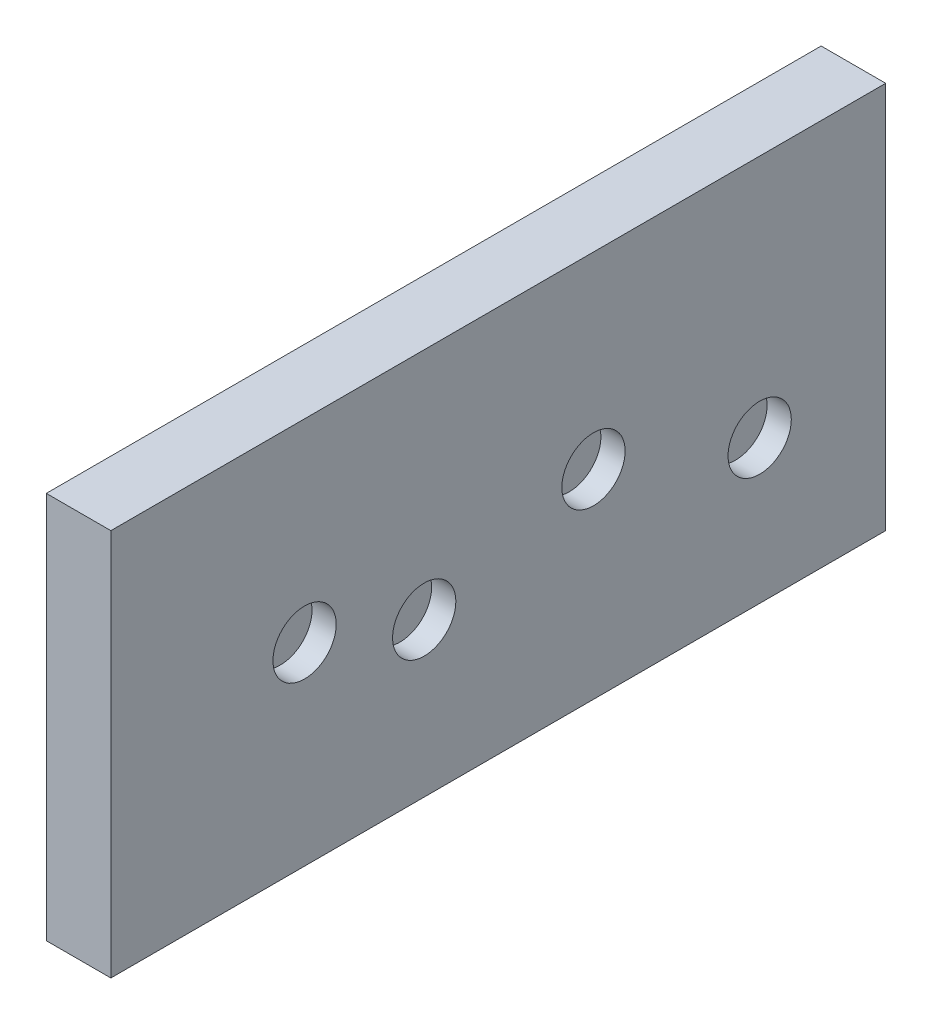
ISO-10303-21;
HEADER;
FILE_DESCRIPTION(('STEP AP214'),'2;1');
FILE_NAME('part.step','',(''),(''),'','','');
FILE_SCHEMA(('AUTOMOTIVE_DESIGN { 1 0 10303 214 1 1 1 1 }'));
ENDSEC;
DATA;
#1=APPLICATION_CONTEXT('core data for automotive mechanical design processes');
#2=APPLICATION_PROTOCOL_DEFINITION('international standard','automotive_design',2000,#1);
#3=PRODUCT_CONTEXT('',#1,'mechanical');
#4=PRODUCT('Part','Part','',(#3));
#5=PRODUCT_RELATED_PRODUCT_CATEGORY('part','',(#4));
#6=PRODUCT_DEFINITION_FORMATION('','',#4);
#7=PRODUCT_DEFINITION_CONTEXT('part definition',#1,'design');
#8=PRODUCT_DEFINITION('design','',#6,#7);
#9=PRODUCT_DEFINITION_SHAPE('','',#8);
#10=(LENGTH_UNIT() NAMED_UNIT(*) SI_UNIT(.MILLI.,.METRE.));
#11=(NAMED_UNIT(*) PLANE_ANGLE_UNIT() SI_UNIT($,.RADIAN.));
#12=(NAMED_UNIT(*) SI_UNIT($,.STERADIAN.) SOLID_ANGLE_UNIT());
#13=UNCERTAINTY_MEASURE_WITH_UNIT(LENGTH_MEASURE(1.E-05),#10,'distance_accuracy_value','');
#14=(GEOMETRIC_REPRESENTATION_CONTEXT(3) GLOBAL_UNCERTAINTY_ASSIGNED_CONTEXT((#13)) GLOBAL_UNIT_ASSIGNED_CONTEXT((#10,
#11,#12)) REPRESENTATION_CONTEXT('',''));
#15=CARTESIAN_POINT('',(0.,0.,0.));
#16=DIRECTION('',(0.,0.,1.));
#17=DIRECTION('',(1.,0.,0.));
#18=AXIS2_PLACEMENT_3D('',#15,#16,#17);
#19=CARTESIAN_POINT('',(12.7,-38.1,0.));
#20=DIRECTION('',(0.,1.,0.));
#21=DIRECTION('',(0.,0.,1.));
#22=AXIS2_PLACEMENT_3D('',#19,#20,#21);
#23=PLANE('',#22);
#24=DIRECTION('',(0.,0.,-1.));
#25=VECTOR('',#24,1.);
#26=CARTESIAN_POINT('',(0.,-38.1,0.));
#27=LINE('',#26,#25);
#28=CARTESIAN_POINT('',(0.,-38.1,76.2));
#29=VERTEX_POINT('',#28);
#30=CARTESIAN_POINT('',(0.,-38.1,-76.2));
#31=VERTEX_POINT('',#30);
#32=EDGE_CURVE('E104',#29,#31,#27,.T.);
#33=ORIENTED_EDGE('',*,*,#32,.T.);
#34=DIRECTION('',(-1.,0.,0.));
#35=VECTOR('',#34,1.);
#36=CARTESIAN_POINT('',(12.7,-38.1,-76.2));
#37=LINE('',#36,#35);
#38=CARTESIAN_POINT('',(12.7,-38.1,-76.2));
#39=VERTEX_POINT('',#38);
#40=EDGE_CURVE('E11',#39,#31,#37,.T.);
#41=ORIENTED_EDGE('',*,*,#40,.F.);
#42=DIRECTION('',(0.,0.,-1.));
#43=VECTOR('',#42,1.);
#44=CARTESIAN_POINT('',(12.7,-38.1,0.));
#45=LINE('',#44,#43);
#46=CARTESIAN_POINT('',(12.7,-38.1,76.2));
#47=VERTEX_POINT('',#46);
#48=EDGE_CURVE('E90',#47,#39,#45,.T.);
#49=ORIENTED_EDGE('',*,*,#48,.F.);
#50=DIRECTION('',(-1.,0.,0.));
#51=VECTOR('',#50,1.);
#52=CARTESIAN_POINT('',(12.7,-38.1,76.2));
#53=LINE('',#52,#51);
#54=EDGE_CURVE('E57',#47,#29,#53,.T.);
#55=ORIENTED_EDGE('',*,*,#54,.T.);
#56=EDGE_LOOP('',(#33,#41,#49,#55));
#57=FACE_BOUND('',#56,.T.);
#58=ADVANCED_FACE('F41',(#57),#23,.F.);
#59=CARTESIAN_POINT('',(12.7,0.,-76.2));
#60=DIRECTION('',(0.,0.,1.));
#61=DIRECTION('',(1.,0.,0.));
#62=AXIS2_PLACEMENT_3D('',#59,#60,#61);
#63=PLANE('',#62);
#64=DIRECTION('',(0.,1.,0.));
#65=VECTOR('',#64,1.);
#66=CARTESIAN_POINT('',(0.,0.,-76.2));
#67=LINE('',#66,#65);
#68=CARTESIAN_POINT('',(0.,38.1,-76.2));
#69=VERTEX_POINT('',#68);
#70=EDGE_CURVE('E95',#31,#69,#67,.T.);
#71=ORIENTED_EDGE('',*,*,#70,.T.);
#72=DIRECTION('',(-1.,0.,0.));
#73=VECTOR('',#72,1.);
#74=CARTESIAN_POINT('',(12.7,38.1,-76.2));
#75=LINE('',#74,#73);
#76=CARTESIAN_POINT('',(12.7,38.1,-76.2));
#77=VERTEX_POINT('',#76);
#78=EDGE_CURVE('E49',#77,#69,#75,.T.);
#79=ORIENTED_EDGE('',*,*,#78,.F.);
#80=DIRECTION('',(0.,1.,0.));
#81=VECTOR('',#80,1.);
#82=CARTESIAN_POINT('',(12.7,0.,-76.2));
#83=LINE('',#82,#81);
#84=EDGE_CURVE('E82',#39,#77,#83,.T.);
#85=ORIENTED_EDGE('',*,*,#84,.F.);
#86=ORIENTED_EDGE('',*,*,#40,.T.);
#87=EDGE_LOOP('',(#71,#79,#85,#86));
#88=FACE_BOUND('',#87,.T.);
#89=ADVANCED_FACE('F94',(#88),#63,.F.);
#90=CARTESIAN_POINT('',(12.7,38.1,0.));
#91=DIRECTION('',(0.,1.,0.));
#92=DIRECTION('',(0.,0.,1.));
#93=AXIS2_PLACEMENT_3D('',#90,#91,#92);
#94=PLANE('',#93);
#95=DIRECTION('',(0.,0.,-1.));
#96=VECTOR('',#95,1.);
#97=CARTESIAN_POINT('',(0.,38.1,0.));
#98=LINE('',#97,#96);
#99=CARTESIAN_POINT('',(0.,38.1,76.2));
#100=VERTEX_POINT('',#99);
#101=EDGE_CURVE('E108',#100,#69,#98,.T.);
#102=ORIENTED_EDGE('',*,*,#101,.F.);
#103=DIRECTION('',(-1.,0.,0.));
#104=VECTOR('',#103,1.);
#105=CARTESIAN_POINT('',(12.7,38.1,76.2));
#106=LINE('',#105,#104);
#107=CARTESIAN_POINT('',(12.7,38.1,76.2));
#108=VERTEX_POINT('',#107);
#109=EDGE_CURVE('E71',#108,#100,#106,.T.);
#110=ORIENTED_EDGE('',*,*,#109,.F.);
#111=DIRECTION('',(0.,0.,-1.));
#112=VECTOR('',#111,1.);
#113=CARTESIAN_POINT('',(12.7,38.1,0.));
#114=LINE('',#113,#112);
#115=EDGE_CURVE('E89',#108,#77,#114,.T.);
#116=ORIENTED_EDGE('',*,*,#115,.T.);
#117=ORIENTED_EDGE('',*,*,#78,.T.);
#118=EDGE_LOOP('',(#102,#110,#116,#117));
#119=FACE_BOUND('',#118,.T.);
#120=ADVANCED_FACE('F98',(#119),#94,.T.);
#121=CARTESIAN_POINT('',(12.7,0.,76.2));
#122=DIRECTION('',(0.,0.,1.));
#123=DIRECTION('',(1.,0.,0.));
#124=AXIS2_PLACEMENT_3D('',#121,#122,#123);
#125=PLANE('',#124);
#126=DIRECTION('',(0.,1.,0.));
#127=VECTOR('',#126,1.);
#128=CARTESIAN_POINT('',(0.,0.,76.2));
#129=LINE('',#128,#127);
#130=EDGE_CURVE('E110',#29,#100,#129,.T.);
#131=ORIENTED_EDGE('',*,*,#130,.F.);
#132=ORIENTED_EDGE('',*,*,#54,.F.);
#133=DIRECTION('',(0.,1.,0.));
#134=VECTOR('',#133,1.);
#135=CARTESIAN_POINT('',(12.7,0.,76.2));
#136=LINE('',#135,#134);
#137=EDGE_CURVE('E99',#47,#108,#136,.T.);
#138=ORIENTED_EDGE('',*,*,#137,.T.);
#139=ORIENTED_EDGE('',*,*,#109,.T.);
#140=EDGE_LOOP('',(#131,#132,#138,#139));
#141=FACE_BOUND('',#140,.T.);
#142=ADVANCED_FACE('F156',(#141),#125,.T.);
#143=CARTESIAN_POINT('',(12.7,0.,0.));
#144=DIRECTION('',(1.,0.,0.));
#145=DIRECTION('',(0.,0.,-1.));
#146=AXIS2_PLACEMENT_3D('',#143,#144,#145);
#147=PLANE('',#146);
#148=CARTESIAN_POINT('',(12.7,0.,38.1));
#149=DIRECTION('',(-1.,0.,0.));
#150=DIRECTION('',(0.,0.,1.));
#151=AXIS2_PLACEMENT_3D('',#148,#149,#150);
#152=CIRCLE('',#151,6.223);
#153=CARTESIAN_POINT('',(12.7,0.,31.877));
#154=VERTEX_POINT('',#153);
#155=EDGE_CURVE('E134',#154,#154,#152,.T.);
#156=ORIENTED_EDGE('',*,*,#155,.T.);
#157=EDGE_LOOP('',(#156));
#158=FACE_BOUND('',#157,.T.);
#159=CARTESIAN_POINT('',(12.7,-7.860160654,14.5712240149026));
#160=DIRECTION('',(-1.,0.,0.));
#161=DIRECTION('',(0.,0.,1.));
#162=AXIS2_PLACEMENT_3D('',#159,#160,#161);
#163=CIRCLE('',#162,6.223);
#164=CARTESIAN_POINT('',(12.7,-7.860160654,8.34822401490261));
#165=VERTEX_POINT('',#164);
#166=EDGE_CURVE('E131',#165,#165,#163,.T.);
#167=ORIENTED_EDGE('',*,*,#166,.T.);
#168=EDGE_LOOP('',(#167));
#169=FACE_BOUND('',#168,.T.);
#170=CARTESIAN_POINT('',(12.7,1.096077429,-18.7225315801618));
#171=DIRECTION('',(-1.,0.,0.));
#172=DIRECTION('',(0.,0.,1.));
#173=AXIS2_PLACEMENT_3D('',#170,#171,#172);
#174=CIRCLE('',#173,6.223);
#175=CARTESIAN_POINT('',(12.7,1.096077429,-24.9455315801618));
#176=VERTEX_POINT('',#175);
#177=EDGE_CURVE('E125',#176,#176,#174,.T.);
#178=ORIENTED_EDGE('',*,*,#177,.T.);
#179=EDGE_LOOP('',(#178));
#180=FACE_BOUND('',#179,.T.);
#181=CARTESIAN_POINT('',(12.7,-9.873506971,-51.4082559918149));
#182=DIRECTION('',(-1.,0.,0.));
#183=DIRECTION('',(0.,0.,1.));
#184=AXIS2_PLACEMENT_3D('',#181,#182,#183);
#185=CIRCLE('',#184,6.223);
#186=CARTESIAN_POINT('',(12.7,-9.873506971,-57.6312559918149));
#187=VERTEX_POINT('',#186);
#188=EDGE_CURVE('E119',#187,#187,#185,.T.);
#189=ORIENTED_EDGE('',*,*,#188,.T.);
#190=EDGE_LOOP('',(#189));
#191=FACE_BOUND('',#190,.T.);
#192=ORIENTED_EDGE('',*,*,#48,.T.);
#193=ORIENTED_EDGE('',*,*,#84,.T.);
#194=ORIENTED_EDGE('',*,*,#115,.F.);
#195=ORIENTED_EDGE('',*,*,#137,.F.);
#196=EDGE_LOOP('',(#192,#193,#194,#195));
#197=FACE_BOUND('',#196,.T.);
#198=ADVANCED_FACE('F86',(#158,#169,#180,#191,#197),#147,.T.);
#199=CARTESIAN_POINT('',(0.,0.,0.));
#200=DIRECTION('',(1.,0.,0.));
#201=DIRECTION('',(0.,0.,-1.));
#202=AXIS2_PLACEMENT_3D('',#199,#200,#201);
#203=PLANE('',#202);
#204=ORIENTED_EDGE('',*,*,#32,.F.);
#205=ORIENTED_EDGE('',*,*,#130,.T.);
#206=ORIENTED_EDGE('',*,*,#101,.T.);
#207=ORIENTED_EDGE('',*,*,#70,.F.);
#208=EDGE_LOOP('',(#204,#205,#206,#207));
#209=FACE_BOUND('',#208,.T.);
#210=ADVANCED_FACE('F155',(#209),#203,.F.);
#211=CARTESIAN_POINT('',(7.9375,-9.873506971,-51.4082559918149));
#212=DIRECTION('',(1.,0.,0.));
#213=DIRECTION('',(0.,0.,-1.));
#214=AXIS2_PLACEMENT_3D('',#211,#212,#213);
#215=CYLINDRICAL_SURFACE('',#214,6.223);
#216=CARTESIAN_POINT('',(7.9375,-9.873506971,-51.4082559918149));
#217=DIRECTION('',(-1.,0.,0.));
#218=DIRECTION('',(0.,0.,1.));
#219=AXIS2_PLACEMENT_3D('',#216,#217,#218);
#220=CIRCLE('',#219,6.223);
#221=CARTESIAN_POINT('',(7.9375,-9.873506971,-57.6312559918149));
#222=VERTEX_POINT('',#221);
#223=EDGE_CURVE('E116',#222,#222,#220,.T.);
#224=CARTESIAN_POINT('',(7.9375,-9.873506971,-57.6312559918149));
#225=CARTESIAN_POINT('',(7.987109375,-9.873506971,-57.6312559918149));
#226=CARTESIAN_POINT('',(8.03671875,-9.873506971,-57.6312559918149));
#227=CARTESIAN_POINT('',(8.1359375,-9.873506971,-57.6312559918149));
#228=CARTESIAN_POINT('',(8.185546875,-9.873506971,-57.6312559918149));
#229=CARTESIAN_POINT('',(8.284765625,-9.873506971,-57.6312559918149));
#230=CARTESIAN_POINT('',(8.334375,-9.873506971,-57.6312559918149));
#231=CARTESIAN_POINT('',(8.43359375,-9.873506971,-57.6312559918149));
#232=CARTESIAN_POINT('',(8.483203125,-9.873506971,-57.6312559918149));
#233=CARTESIAN_POINT('',(8.582421875,-9.873506971,-57.6312559918149));
#234=CARTESIAN_POINT('',(8.63203125,-9.873506971,-57.6312559918149));
#235=CARTESIAN_POINT('',(8.73125,-9.873506971,-57.6312559918149));
#236=CARTESIAN_POINT('',(8.780859375,-9.873506971,-57.6312559918149));
#237=CARTESIAN_POINT('',(8.880078125,-9.873506971,-57.6312559918149));
#238=CARTESIAN_POINT('',(8.9296875,-9.873506971,-57.6312559918149));
#239=CARTESIAN_POINT('',(9.02890625,-9.873506971,-57.6312559918149));
#240=CARTESIAN_POINT('',(9.078515625,-9.873506971,-57.6312559918149));
#241=CARTESIAN_POINT('',(9.177734375,-9.873506971,-57.6312559918149));
#242=CARTESIAN_POINT('',(9.22734375,-9.873506971,-57.6312559918149));
#243=CARTESIAN_POINT('',(9.3265625,-9.873506971,-57.6312559918149));
#244=CARTESIAN_POINT('',(9.376171875,-9.873506971,-57.6312559918149));
#245=CARTESIAN_POINT('',(9.475390625,-9.873506971,-57.6312559918149));
#246=CARTESIAN_POINT('',(9.525,-9.873506971,-57.6312559918149));
#247=CARTESIAN_POINT('',(9.62421875,-9.873506971,-57.6312559918149));
#248=CARTESIAN_POINT('',(9.673828125,-9.873506971,-57.6312559918149));
#249=CARTESIAN_POINT('',(9.773046875,-9.873506971,-57.6312559918149));
#250=CARTESIAN_POINT('',(9.82265625,-9.873506971,-57.6312559918149));
#251=CARTESIAN_POINT('',(9.921875,-9.873506971,-57.6312559918149));
#252=CARTESIAN_POINT('',(9.971484375,-9.873506971,-57.6312559918149));
#253=CARTESIAN_POINT('',(10.070703125,-9.873506971,-57.6312559918149));
#254=CARTESIAN_POINT('',(10.1203125,-9.873506971,-57.6312559918149));
#255=CARTESIAN_POINT('',(10.21953125,-9.873506971,-57.6312559918149));
#256=CARTESIAN_POINT('',(10.269140625,-9.873506971,-57.6312559918149));
#257=CARTESIAN_POINT('',(10.368359375,-9.873506971,-57.6312559918149));
#258=CARTESIAN_POINT('',(10.41796875,-9.873506971,-57.6312559918149));
#259=CARTESIAN_POINT('',(10.5171875,-9.873506971,-57.6312559918149));
#260=CARTESIAN_POINT('',(10.566796875,-9.873506971,-57.6312559918149));
#261=CARTESIAN_POINT('',(10.666015625,-9.873506971,-57.6312559918149));
#262=CARTESIAN_POINT('',(10.715625,-9.873506971,-57.6312559918149));
#263=CARTESIAN_POINT('',(10.81484375,-9.873506971,-57.6312559918149));
#264=CARTESIAN_POINT('',(10.864453125,-9.873506971,-57.6312559918149));
#265=CARTESIAN_POINT('',(10.963671875,-9.873506971,-57.6312559918149));
#266=CARTESIAN_POINT('',(11.01328125,-9.873506971,-57.6312559918149));
#267=CARTESIAN_POINT('',(11.1125,-9.873506971,-57.6312559918149));
#268=CARTESIAN_POINT('',(11.162109375,-9.873506971,-57.6312559918149));
#269=CARTESIAN_POINT('',(11.261328125,-9.873506971,-57.6312559918149));
#270=CARTESIAN_POINT('',(11.3109375,-9.873506971,-57.6312559918149));
#271=CARTESIAN_POINT('',(11.41015625,-9.873506971,-57.6312559918149));
#272=CARTESIAN_POINT('',(11.459765625,-9.873506971,-57.6312559918149));
#273=CARTESIAN_POINT('',(11.558984375,-9.873506971,-57.6312559918149));
#274=CARTESIAN_POINT('',(11.60859375,-9.873506971,-57.6312559918149));
#275=CARTESIAN_POINT('',(11.7078125,-9.873506971,-57.6312559918149));
#276=CARTESIAN_POINT('',(11.757421875,-9.873506971,-57.6312559918149));
#277=CARTESIAN_POINT('',(11.856640625,-9.873506971,-57.6312559918149));
#278=CARTESIAN_POINT('',(11.90625,-9.873506971,-57.6312559918149));
#279=CARTESIAN_POINT('',(12.00546875,-9.873506971,-57.6312559918149));
#280=CARTESIAN_POINT('',(12.055078125,-9.873506971,-57.6312559918149));
#281=CARTESIAN_POINT('',(12.154296875,-9.873506971,-57.6312559918149));
#282=CARTESIAN_POINT('',(12.20390625,-9.873506971,-57.6312559918149));
#283=CARTESIAN_POINT('',(12.303125,-9.873506971,-57.6312559918149));
#284=CARTESIAN_POINT('',(12.352734375,-9.873506971,-57.6312559918149));
#285=CARTESIAN_POINT('',(12.451953125,-9.873506971,-57.6312559918149));
#286=CARTESIAN_POINT('',(12.5015625,-9.873506971,-57.6312559918149));
#287=CARTESIAN_POINT('',(12.60078125,-9.873506971,-57.6312559918149));
#288=CARTESIAN_POINT('',(12.650390625,-9.873506971,-57.6312559918149));
#289=CARTESIAN_POINT('',(12.7,-9.873506971,-57.6312559918149));
#290=B_SPLINE_CURVE_WITH_KNOTS('',3,(#224,#225,#226,#227,#228,#229,#230,#231,#232,#233,#234,
#235,#236,#237,#238,#239,#240,#241,#242,#243,#244,#245,#246,#247,#248,#249,#250,#251,#252,#253,
#254,#255,#256,#257,#258,#259,#260,#261,#262,#263,#264,#265,#266,#267,#268,#269,#270,#271,#272,
#273,#274,#275,#276,#277,#278,#279,#280,#281,#282,#283,#284,#285,#286,#287,#288,#289),
.UNSPECIFIED.,.F.,.F.,(4,2,2,2,2,2,2,2,2,2,2,2,2,2,2,2,2,2,2,2,2,2,2,2,2,2,2,2,2,2,2,2,4),(0.,
0.148828124999998,0.297656249999998,0.446484374999999,0.595312499999999,0.744140624999999,
0.892968749999999,1.041796875,1.190625,1.339453125,1.48828125,1.637109375,1.7859375,1.934765625,
2.08359375,2.232421875,2.38125,2.530078125,2.67890625,2.827734375,2.9765625,3.125390625,
3.27421875,3.423046875,3.571875,3.720703125,3.86953125,4.018359375,4.1671875,4.316015625,
4.46484375,4.613671875,4.7625),.UNSPECIFIED.);
#291=EDGE_CURVE('BSEAM168',#222,#187,#290,.T.);
#292=ORIENTED_EDGE('',*,*,#223,.T.);
#293=ORIENTED_EDGE('',*,*,#188,.F.);
#294=ORIENTED_EDGE('',*,*,#291,.T.);
#295=ORIENTED_EDGE('',*,*,#291,.F.);
#296=EDGE_LOOP('',(#292,#294,#293,#295));
#297=FACE_BOUND('',#296,.T.);
#298=ADVANCED_FACE('F168',(#297),#215,.F.);
#299=CARTESIAN_POINT('',(7.9375,-9.873506971,-51.4082559918149));
#300=DIRECTION('',(-1.,0.,0.));
#301=DIRECTION('',(0.,0.,1.));
#302=AXIS2_PLACEMENT_3D('',#299,#300,#301);
#303=PLANE('',#302);
#304=ORIENTED_EDGE('',*,*,#223,.F.);
#305=EDGE_LOOP('',(#304));
#306=FACE_BOUND('',#305,.T.);
#307=ADVANCED_FACE('F170',(#306),#303,.F.);
#308=CARTESIAN_POINT('',(7.9375,1.096077429,-18.7225315801618));
#309=DIRECTION('',(1.,0.,0.));
#310=DIRECTION('',(0.,0.,-1.));
#311=AXIS2_PLACEMENT_3D('',#308,#309,#310);
#312=CYLINDRICAL_SURFACE('',#311,6.223);
#313=CARTESIAN_POINT('',(7.9375,1.096077429,-18.7225315801618));
#314=DIRECTION('',(-1.,0.,0.));
#315=DIRECTION('',(0.,0.,1.));
#316=AXIS2_PLACEMENT_3D('',#313,#314,#315);
#317=CIRCLE('',#316,6.223);
#318=CARTESIAN_POINT('',(7.9375,1.096077429,-24.9455315801618));
#319=VERTEX_POINT('',#318);
#320=EDGE_CURVE('E122',#319,#319,#317,.T.);
#321=CARTESIAN_POINT('',(7.9375,1.096077429,-24.9455315801618));
#322=CARTESIAN_POINT('',(7.987109375,1.096077429,-24.9455315801618));
#323=CARTESIAN_POINT('',(8.03671875,1.096077429,-24.9455315801618));
#324=CARTESIAN_POINT('',(8.1359375,1.096077429,-24.9455315801618));
#325=CARTESIAN_POINT('',(8.185546875,1.096077429,-24.9455315801618));
#326=CARTESIAN_POINT('',(8.284765625,1.096077429,-24.9455315801618));
#327=CARTESIAN_POINT('',(8.334375,1.096077429,-24.9455315801618));
#328=CARTESIAN_POINT('',(8.43359375,1.096077429,-24.9455315801618));
#329=CARTESIAN_POINT('',(8.483203125,1.096077429,-24.9455315801618));
#330=CARTESIAN_POINT('',(8.582421875,1.096077429,-24.9455315801618));
#331=CARTESIAN_POINT('',(8.63203125,1.096077429,-24.9455315801618));
#332=CARTESIAN_POINT('',(8.73125,1.096077429,-24.9455315801618));
#333=CARTESIAN_POINT('',(8.780859375,1.096077429,-24.9455315801618));
#334=CARTESIAN_POINT('',(8.880078125,1.096077429,-24.9455315801618));
#335=CARTESIAN_POINT('',(8.9296875,1.096077429,-24.9455315801618));
#336=CARTESIAN_POINT('',(9.02890625,1.096077429,-24.9455315801618));
#337=CARTESIAN_POINT('',(9.078515625,1.096077429,-24.9455315801618));
#338=CARTESIAN_POINT('',(9.177734375,1.096077429,-24.9455315801618));
#339=CARTESIAN_POINT('',(9.22734375,1.096077429,-24.9455315801618));
#340=CARTESIAN_POINT('',(9.3265625,1.096077429,-24.9455315801618));
#341=CARTESIAN_POINT('',(9.376171875,1.096077429,-24.9455315801618));
#342=CARTESIAN_POINT('',(9.475390625,1.096077429,-24.9455315801618));
#343=CARTESIAN_POINT('',(9.525,1.096077429,-24.9455315801618));
#344=CARTESIAN_POINT('',(9.62421875,1.096077429,-24.9455315801618));
#345=CARTESIAN_POINT('',(9.673828125,1.096077429,-24.9455315801618));
#346=CARTESIAN_POINT('',(9.773046875,1.096077429,-24.9455315801618));
#347=CARTESIAN_POINT('',(9.82265625,1.096077429,-24.9455315801618));
#348=CARTESIAN_POINT('',(9.921875,1.096077429,-24.9455315801618));
#349=CARTESIAN_POINT('',(9.971484375,1.096077429,-24.9455315801618));
#350=CARTESIAN_POINT('',(10.070703125,1.096077429,-24.9455315801618));
#351=CARTESIAN_POINT('',(10.1203125,1.096077429,-24.9455315801618));
#352=CARTESIAN_POINT('',(10.21953125,1.096077429,-24.9455315801618));
#353=CARTESIAN_POINT('',(10.269140625,1.096077429,-24.9455315801618));
#354=CARTESIAN_POINT('',(10.368359375,1.096077429,-24.9455315801618));
#355=CARTESIAN_POINT('',(10.41796875,1.096077429,-24.9455315801618));
#356=CARTESIAN_POINT('',(10.5171875,1.096077429,-24.9455315801618));
#357=CARTESIAN_POINT('',(10.566796875,1.096077429,-24.9455315801618));
#358=CARTESIAN_POINT('',(10.666015625,1.096077429,-24.9455315801618));
#359=CARTESIAN_POINT('',(10.715625,1.096077429,-24.9455315801618));
#360=CARTESIAN_POINT('',(10.81484375,1.096077429,-24.9455315801618));
#361=CARTESIAN_POINT('',(10.864453125,1.096077429,-24.9455315801618));
#362=CARTESIAN_POINT('',(10.963671875,1.096077429,-24.9455315801618));
#363=CARTESIAN_POINT('',(11.01328125,1.096077429,-24.9455315801618));
#364=CARTESIAN_POINT('',(11.1125,1.096077429,-24.9455315801618));
#365=CARTESIAN_POINT('',(11.162109375,1.096077429,-24.9455315801618));
#366=CARTESIAN_POINT('',(11.261328125,1.096077429,-24.9455315801618));
#367=CARTESIAN_POINT('',(11.3109375,1.096077429,-24.9455315801618));
#368=CARTESIAN_POINT('',(11.41015625,1.096077429,-24.9455315801618));
#369=CARTESIAN_POINT('',(11.459765625,1.096077429,-24.9455315801618));
#370=CARTESIAN_POINT('',(11.558984375,1.096077429,-24.9455315801618));
#371=CARTESIAN_POINT('',(11.60859375,1.096077429,-24.9455315801618));
#372=CARTESIAN_POINT('',(11.7078125,1.096077429,-24.9455315801618));
#373=CARTESIAN_POINT('',(11.757421875,1.096077429,-24.9455315801618));
#374=CARTESIAN_POINT('',(11.856640625,1.096077429,-24.9455315801618));
#375=CARTESIAN_POINT('',(11.90625,1.096077429,-24.9455315801618));
#376=CARTESIAN_POINT('',(12.00546875,1.096077429,-24.9455315801618));
#377=CARTESIAN_POINT('',(12.055078125,1.096077429,-24.9455315801618));
#378=CARTESIAN_POINT('',(12.154296875,1.096077429,-24.9455315801618));
#379=CARTESIAN_POINT('',(12.20390625,1.096077429,-24.9455315801618));
#380=CARTESIAN_POINT('',(12.303125,1.096077429,-24.9455315801618));
#381=CARTESIAN_POINT('',(12.352734375,1.096077429,-24.9455315801618));
#382=CARTESIAN_POINT('',(12.451953125,1.096077429,-24.9455315801618));
#383=CARTESIAN_POINT('',(12.5015625,1.096077429,-24.9455315801618));
#384=CARTESIAN_POINT('',(12.60078125,1.096077429,-24.9455315801618));
#385=CARTESIAN_POINT('',(12.650390625,1.096077429,-24.9455315801618));
#386=CARTESIAN_POINT('',(12.7,1.096077429,-24.9455315801618));
#387=B_SPLINE_CURVE_WITH_KNOTS('',3,(#321,#322,#323,#324,#325,#326,#327,#328,#329,#330,#331,
#332,#333,#334,#335,#336,#337,#338,#339,#340,#341,#342,#343,#344,#345,#346,#347,#348,#349,#350,
#351,#352,#353,#354,#355,#356,#357,#358,#359,#360,#361,#362,#363,#364,#365,#366,#367,#368,#369,
#370,#371,#372,#373,#374,#375,#376,#377,#378,#379,#380,#381,#382,#383,#384,#385,#386),
.UNSPECIFIED.,.F.,.F.,(4,2,2,2,2,2,2,2,2,2,2,2,2,2,2,2,2,2,2,2,2,2,2,2,2,2,2,2,2,2,2,2,4),(0.,
0.148828124999998,0.297656249999998,0.446484374999999,0.595312499999999,0.744140624999999,
0.892968749999999,1.041796875,1.190625,1.339453125,1.48828125,1.637109375,1.7859375,1.934765625,
2.08359375,2.232421875,2.38125,2.530078125,2.67890625,2.827734375,2.9765625,3.125390625,
3.27421875,3.423046875,3.571875,3.720703125,3.86953125,4.018359375,4.1671875,4.316015625,
4.46484375,4.613671875,4.7625),.UNSPECIFIED.);
#388=EDGE_CURVE('BSEAM173',#319,#176,#387,.T.);
#389=ORIENTED_EDGE('',*,*,#320,.T.);
#390=ORIENTED_EDGE('',*,*,#177,.F.);
#391=ORIENTED_EDGE('',*,*,#388,.T.);
#392=ORIENTED_EDGE('',*,*,#388,.F.);
#393=EDGE_LOOP('',(#389,#391,#390,#392));
#394=FACE_BOUND('',#393,.T.);
#395=ADVANCED_FACE('F173',(#394),#312,.F.);
#396=CARTESIAN_POINT('',(7.9375,1.096077429,-18.7225315801618));
#397=DIRECTION('',(-1.,0.,0.));
#398=DIRECTION('',(0.,0.,1.));
#399=AXIS2_PLACEMENT_3D('',#396,#397,#398);
#400=PLANE('',#399);
#401=ORIENTED_EDGE('',*,*,#320,.F.);
#402=EDGE_LOOP('',(#401));
#403=FACE_BOUND('',#402,.T.);
#404=ADVANCED_FACE('F178',(#403),#400,.F.);
#405=CARTESIAN_POINT('',(7.9375,-7.860160654,14.5712240149026));
#406=DIRECTION('',(1.,0.,0.));
#407=DIRECTION('',(0.,0.,-1.));
#408=AXIS2_PLACEMENT_3D('',#405,#406,#407);
#409=CYLINDRICAL_SURFACE('',#408,6.223);
#410=CARTESIAN_POINT('',(7.9375,-7.860160654,14.5712240149026));
#411=DIRECTION('',(-1.,0.,0.));
#412=DIRECTION('',(0.,0.,1.));
#413=AXIS2_PLACEMENT_3D('',#410,#411,#412);
#414=CIRCLE('',#413,6.223);
#415=CARTESIAN_POINT('',(7.9375,-7.860160654,8.34822401490261));
#416=VERTEX_POINT('',#415);
#417=EDGE_CURVE('E128',#416,#416,#414,.T.);
#418=CARTESIAN_POINT('',(7.9375,-7.860160654,8.34822401490261));
#419=CARTESIAN_POINT('',(7.987109375,-7.860160654,8.34822401490261));
#420=CARTESIAN_POINT('',(8.03671875,-7.860160654,8.34822401490261));
#421=CARTESIAN_POINT('',(8.1359375,-7.860160654,8.34822401490261));
#422=CARTESIAN_POINT('',(8.185546875,-7.860160654,8.34822401490261));
#423=CARTESIAN_POINT('',(8.284765625,-7.860160654,8.34822401490261));
#424=CARTESIAN_POINT('',(8.334375,-7.860160654,8.34822401490261));
#425=CARTESIAN_POINT('',(8.43359375,-7.860160654,8.34822401490261));
#426=CARTESIAN_POINT('',(8.483203125,-7.860160654,8.34822401490261));
#427=CARTESIAN_POINT('',(8.582421875,-7.860160654,8.34822401490261));
#428=CARTESIAN_POINT('',(8.63203125,-7.860160654,8.34822401490261));
#429=CARTESIAN_POINT('',(8.73125,-7.860160654,8.34822401490261));
#430=CARTESIAN_POINT('',(8.780859375,-7.860160654,8.34822401490261));
#431=CARTESIAN_POINT('',(8.880078125,-7.860160654,8.34822401490261));
#432=CARTESIAN_POINT('',(8.9296875,-7.860160654,8.34822401490261));
#433=CARTESIAN_POINT('',(9.02890625,-7.860160654,8.34822401490261));
#434=CARTESIAN_POINT('',(9.078515625,-7.860160654,8.34822401490261));
#435=CARTESIAN_POINT('',(9.177734375,-7.860160654,8.34822401490261));
#436=CARTESIAN_POINT('',(9.22734375,-7.860160654,8.34822401490261));
#437=CARTESIAN_POINT('',(9.3265625,-7.860160654,8.34822401490261));
#438=CARTESIAN_POINT('',(9.376171875,-7.860160654,8.34822401490261));
#439=CARTESIAN_POINT('',(9.475390625,-7.860160654,8.34822401490261));
#440=CARTESIAN_POINT('',(9.525,-7.860160654,8.34822401490261));
#441=CARTESIAN_POINT('',(9.62421875,-7.860160654,8.34822401490261));
#442=CARTESIAN_POINT('',(9.673828125,-7.860160654,8.34822401490261));
#443=CARTESIAN_POINT('',(9.773046875,-7.860160654,8.34822401490261));
#444=CARTESIAN_POINT('',(9.82265625,-7.860160654,8.34822401490261));
#445=CARTESIAN_POINT('',(9.921875,-7.860160654,8.34822401490261));
#446=CARTESIAN_POINT('',(9.971484375,-7.860160654,8.34822401490261));
#447=CARTESIAN_POINT('',(10.070703125,-7.860160654,8.34822401490261));
#448=CARTESIAN_POINT('',(10.1203125,-7.860160654,8.34822401490261));
#449=CARTESIAN_POINT('',(10.21953125,-7.860160654,8.34822401490261));
#450=CARTESIAN_POINT('',(10.269140625,-7.860160654,8.34822401490261));
#451=CARTESIAN_POINT('',(10.368359375,-7.860160654,8.34822401490261));
#452=CARTESIAN_POINT('',(10.41796875,-7.860160654,8.34822401490261));
#453=CARTESIAN_POINT('',(10.5171875,-7.860160654,8.34822401490261));
#454=CARTESIAN_POINT('',(10.566796875,-7.860160654,8.34822401490261));
#455=CARTESIAN_POINT('',(10.666015625,-7.860160654,8.34822401490261));
#456=CARTESIAN_POINT('',(10.715625,-7.860160654,8.34822401490261));
#457=CARTESIAN_POINT('',(10.81484375,-7.860160654,8.34822401490261));
#458=CARTESIAN_POINT('',(10.864453125,-7.860160654,8.34822401490261));
#459=CARTESIAN_POINT('',(10.963671875,-7.860160654,8.34822401490261));
#460=CARTESIAN_POINT('',(11.01328125,-7.860160654,8.34822401490261));
#461=CARTESIAN_POINT('',(11.1125,-7.860160654,8.34822401490261));
#462=CARTESIAN_POINT('',(11.162109375,-7.860160654,8.34822401490261));
#463=CARTESIAN_POINT('',(11.261328125,-7.860160654,8.34822401490261));
#464=CARTESIAN_POINT('',(11.3109375,-7.860160654,8.34822401490261));
#465=CARTESIAN_POINT('',(11.41015625,-7.860160654,8.34822401490261));
#466=CARTESIAN_POINT('',(11.459765625,-7.860160654,8.34822401490261));
#467=CARTESIAN_POINT('',(11.558984375,-7.860160654,8.34822401490261));
#468=CARTESIAN_POINT('',(11.60859375,-7.860160654,8.34822401490261));
#469=CARTESIAN_POINT('',(11.7078125,-7.860160654,8.34822401490261));
#470=CARTESIAN_POINT('',(11.757421875,-7.860160654,8.34822401490261));
#471=CARTESIAN_POINT('',(11.856640625,-7.860160654,8.34822401490261));
#472=CARTESIAN_POINT('',(11.90625,-7.860160654,8.34822401490261));
#473=CARTESIAN_POINT('',(12.00546875,-7.860160654,8.34822401490261));
#474=CARTESIAN_POINT('',(12.055078125,-7.860160654,8.34822401490261));
#475=CARTESIAN_POINT('',(12.154296875,-7.860160654,8.34822401490261));
#476=CARTESIAN_POINT('',(12.20390625,-7.860160654,8.34822401490261));
#477=CARTESIAN_POINT('',(12.303125,-7.860160654,8.34822401490261));
#478=CARTESIAN_POINT('',(12.352734375,-7.860160654,8.34822401490261));
#479=CARTESIAN_POINT('',(12.451953125,-7.860160654,8.34822401490261));
#480=CARTESIAN_POINT('',(12.5015625,-7.860160654,8.34822401490261));
#481=CARTESIAN_POINT('',(12.60078125,-7.860160654,8.34822401490261));
#482=CARTESIAN_POINT('',(12.650390625,-7.860160654,8.34822401490261));
#483=CARTESIAN_POINT('',(12.7,-7.860160654,8.34822401490261));
#484=B_SPLINE_CURVE_WITH_KNOTS('',3,(#418,#419,#420,#421,#422,#423,#424,#425,#426,#427,#428,
#429,#430,#431,#432,#433,#434,#435,#436,#437,#438,#439,#440,#441,#442,#443,#444,#445,#446,#447,
#448,#449,#450,#451,#452,#453,#454,#455,#456,#457,#458,#459,#460,#461,#462,#463,#464,#465,#466,
#467,#468,#469,#470,#471,#472,#473,#474,#475,#476,#477,#478,#479,#480,#481,#482,#483),
.UNSPECIFIED.,.F.,.F.,(4,2,2,2,2,2,2,2,2,2,2,2,2,2,2,2,2,2,2,2,2,2,2,2,2,2,2,2,2,2,2,2,4),(0.,
0.148828124999998,0.297656249999998,0.446484374999999,0.595312499999999,0.744140624999999,
0.892968749999999,1.041796875,1.190625,1.339453125,1.48828125,1.637109375,1.7859375,1.934765625,
2.08359375,2.232421875,2.38125,2.530078125,2.67890625,2.827734375,2.9765625,3.125390625,
3.27421875,3.423046875,3.571875,3.720703125,3.86953125,4.018359375,4.1671875,4.316015625,
4.46484375,4.613671875,4.7625),.UNSPECIFIED.);
#485=EDGE_CURVE('BSEAM181',#416,#165,#484,.T.);
#486=ORIENTED_EDGE('',*,*,#417,.T.);
#487=ORIENTED_EDGE('',*,*,#166,.F.);
#488=ORIENTED_EDGE('',*,*,#485,.T.);
#489=ORIENTED_EDGE('',*,*,#485,.F.);
#490=EDGE_LOOP('',(#486,#488,#487,#489));
#491=FACE_BOUND('',#490,.T.);
#492=ADVANCED_FACE('F181',(#491),#409,.F.);
#493=CARTESIAN_POINT('',(7.9375,-7.860160654,14.5712240149026));
#494=DIRECTION('',(-1.,0.,0.));
#495=DIRECTION('',(0.,0.,1.));
#496=AXIS2_PLACEMENT_3D('',#493,#494,#495);
#497=PLANE('',#496);
#498=ORIENTED_EDGE('',*,*,#417,.F.);
#499=EDGE_LOOP('',(#498));
#500=FACE_BOUND('',#499,.T.);
#501=ADVANCED_FACE('F149',(#500),#497,.F.);
#502=CARTESIAN_POINT('',(7.9375,0.,38.1));
#503=DIRECTION('',(1.,0.,0.));
#504=DIRECTION('',(0.,0.,-1.));
#505=AXIS2_PLACEMENT_3D('',#502,#503,#504);
#506=CYLINDRICAL_SURFACE('',#505,6.223);
#507=CARTESIAN_POINT('',(7.9375,0.,38.1));
#508=DIRECTION('',(-1.,0.,0.));
#509=DIRECTION('',(0.,0.,1.));
#510=AXIS2_PLACEMENT_3D('',#507,#508,#509);
#511=CIRCLE('',#510,6.223);
#512=CARTESIAN_POINT('',(7.9375,0.,31.877));
#513=VERTEX_POINT('',#512);
#514=EDGE_CURVE('E106',#513,#513,#511,.T.);
#515=CARTESIAN_POINT('',(7.9375,0.,31.877));
#516=CARTESIAN_POINT('',(7.987109375,0.,31.877));
#517=CARTESIAN_POINT('',(8.03671875,0.,31.877));
#518=CARTESIAN_POINT('',(8.1359375,0.,31.877));
#519=CARTESIAN_POINT('',(8.185546875,0.,31.877));
#520=CARTESIAN_POINT('',(8.284765625,0.,31.877));
#521=CARTESIAN_POINT('',(8.334375,0.,31.877));
#522=CARTESIAN_POINT('',(8.43359375,0.,31.877));
#523=CARTESIAN_POINT('',(8.483203125,0.,31.877));
#524=CARTESIAN_POINT('',(8.582421875,0.,31.877));
#525=CARTESIAN_POINT('',(8.63203125,0.,31.877));
#526=CARTESIAN_POINT('',(8.73125,0.,31.877));
#527=CARTESIAN_POINT('',(8.780859375,0.,31.877));
#528=CARTESIAN_POINT('',(8.880078125,0.,31.877));
#529=CARTESIAN_POINT('',(8.9296875,0.,31.877));
#530=CARTESIAN_POINT('',(9.02890625,0.,31.877));
#531=CARTESIAN_POINT('',(9.078515625,0.,31.877));
#532=CARTESIAN_POINT('',(9.177734375,0.,31.877));
#533=CARTESIAN_POINT('',(9.22734375,0.,31.877));
#534=CARTESIAN_POINT('',(9.3265625,0.,31.877));
#535=CARTESIAN_POINT('',(9.376171875,0.,31.877));
#536=CARTESIAN_POINT('',(9.475390625,0.,31.877));
#537=CARTESIAN_POINT('',(9.525,0.,31.877));
#538=CARTESIAN_POINT('',(9.62421875,0.,31.877));
#539=CARTESIAN_POINT('',(9.673828125,0.,31.877));
#540=CARTESIAN_POINT('',(9.773046875,0.,31.877));
#541=CARTESIAN_POINT('',(9.82265625,0.,31.877));
#542=CARTESIAN_POINT('',(9.921875,0.,31.877));
#543=CARTESIAN_POINT('',(9.971484375,0.,31.877));
#544=CARTESIAN_POINT('',(10.070703125,0.,31.877));
#545=CARTESIAN_POINT('',(10.1203125,0.,31.877));
#546=CARTESIAN_POINT('',(10.21953125,0.,31.877));
#547=CARTESIAN_POINT('',(10.269140625,0.,31.877));
#548=CARTESIAN_POINT('',(10.368359375,0.,31.877));
#549=CARTESIAN_POINT('',(10.41796875,0.,31.877));
#550=CARTESIAN_POINT('',(10.5171875,0.,31.877));
#551=CARTESIAN_POINT('',(10.566796875,0.,31.877));
#552=CARTESIAN_POINT('',(10.666015625,0.,31.877));
#553=CARTESIAN_POINT('',(10.715625,0.,31.877));
#554=CARTESIAN_POINT('',(10.81484375,0.,31.877));
#555=CARTESIAN_POINT('',(10.864453125,0.,31.877));
#556=CARTESIAN_POINT('',(10.963671875,0.,31.877));
#557=CARTESIAN_POINT('',(11.01328125,0.,31.877));
#558=CARTESIAN_POINT('',(11.1125,0.,31.877));
#559=CARTESIAN_POINT('',(11.162109375,0.,31.877));
#560=CARTESIAN_POINT('',(11.261328125,0.,31.877));
#561=CARTESIAN_POINT('',(11.3109375,0.,31.877));
#562=CARTESIAN_POINT('',(11.41015625,0.,31.877));
#563=CARTESIAN_POINT('',(11.459765625,0.,31.877));
#564=CARTESIAN_POINT('',(11.558984375,0.,31.877));
#565=CARTESIAN_POINT('',(11.60859375,0.,31.877));
#566=CARTESIAN_POINT('',(11.7078125,0.,31.877));
#567=CARTESIAN_POINT('',(11.757421875,0.,31.877));
#568=CARTESIAN_POINT('',(11.856640625,0.,31.877));
#569=CARTESIAN_POINT('',(11.90625,0.,31.877));
#570=CARTESIAN_POINT('',(12.00546875,0.,31.877));
#571=CARTESIAN_POINT('',(12.055078125,0.,31.877));
#572=CARTESIAN_POINT('',(12.154296875,0.,31.877));
#573=CARTESIAN_POINT('',(12.20390625,0.,31.877));
#574=CARTESIAN_POINT('',(12.303125,0.,31.877));
#575=CARTESIAN_POINT('',(12.352734375,0.,31.877));
#576=CARTESIAN_POINT('',(12.451953125,0.,31.877));
#577=CARTESIAN_POINT('',(12.5015625,0.,31.877));
#578=CARTESIAN_POINT('',(12.60078125,0.,31.877));
#579=CARTESIAN_POINT('',(12.650390625,0.,31.877));
#580=CARTESIAN_POINT('',(12.7,0.,31.877));
#581=B_SPLINE_CURVE_WITH_KNOTS('',3,(#515,#516,#517,#518,#519,#520,#521,#522,#523,#524,#525,
#526,#527,#528,#529,#530,#531,#532,#533,#534,#535,#536,#537,#538,#539,#540,#541,#542,#543,#544,
#545,#546,#547,#548,#549,#550,#551,#552,#553,#554,#555,#556,#557,#558,#559,#560,#561,#562,#563,
#564,#565,#566,#567,#568,#569,#570,#571,#572,#573,#574,#575,#576,#577,#578,#579,#580),
.UNSPECIFIED.,.F.,.F.,(4,2,2,2,2,2,2,2,2,2,2,2,2,2,2,2,2,2,2,2,2,2,2,2,2,2,2,2,2,2,2,2,4),(0.,
0.148828124999998,0.297656249999998,0.446484374999999,0.595312499999999,0.744140624999999,
0.892968749999999,1.041796875,1.190625,1.339453125,1.48828125,1.637109375,1.7859375,1.934765625,
2.08359375,2.232421875,2.38125,2.530078125,2.67890625,2.827734375,2.9765625,3.125390625,
3.27421875,3.423046875,3.571875,3.720703125,3.86953125,4.018359375,4.1671875,4.316015625,
4.46484375,4.613671875,4.7625),.UNSPECIFIED.);
#582=EDGE_CURVE('BSEAM140',#513,#154,#581,.T.);
#583=ORIENTED_EDGE('',*,*,#514,.T.);
#584=ORIENTED_EDGE('',*,*,#155,.F.);
#585=ORIENTED_EDGE('',*,*,#582,.T.);
#586=ORIENTED_EDGE('',*,*,#582,.F.);
#587=EDGE_LOOP('',(#583,#585,#584,#586));
#588=FACE_BOUND('',#587,.T.);
#589=ADVANCED_FACE('F140',(#588),#506,.F.);
#590=CARTESIAN_POINT('',(7.9375,0.,38.1));
#591=DIRECTION('',(-1.,0.,0.));
#592=DIRECTION('',(0.,0.,1.));
#593=AXIS2_PLACEMENT_3D('',#590,#591,#592);
#594=PLANE('',#593);
#595=ORIENTED_EDGE('',*,*,#514,.F.);
#596=EDGE_LOOP('',(#595));
#597=FACE_BOUND('',#596,.T.);
#598=ADVANCED_FACE('F143',(#597),#594,.F.);
#599=CLOSED_SHELL('',(#58,#89,#120,#142,#198,#210,#298,#307,#395,#404,#492,#501,#589,#598));
#600=MANIFOLD_SOLID_BREP('B2',#599);
#601=ADVANCED_BREP_SHAPE_REPRESENTATION('',(#18,#600),#14);
#602=SHAPE_DEFINITION_REPRESENTATION(#9,#601);
ENDSEC;
END-ISO-10303-21;
